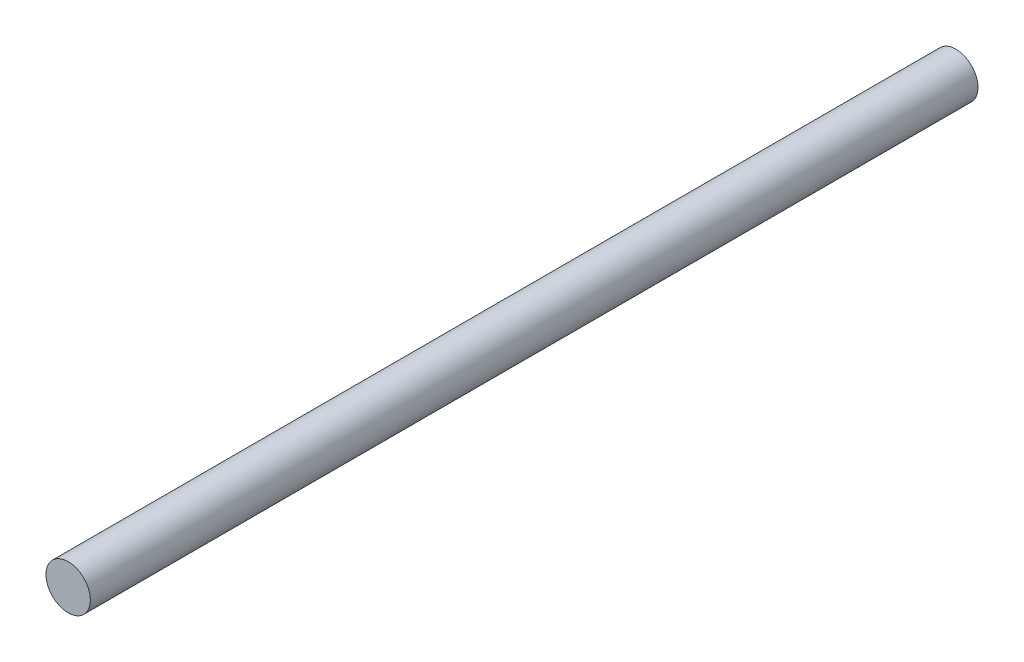
ISO-10303-21;
HEADER;
FILE_DESCRIPTION(('STEP AP214'),'2;1');
FILE_NAME('part.step','',(''),(''),'','','');
FILE_SCHEMA(('AUTOMOTIVE_DESIGN { 1 0 10303 214 1 1 1 1 }'));
ENDSEC;
DATA;
#1=APPLICATION_CONTEXT('core data for automotive mechanical design processes');
#2=APPLICATION_PROTOCOL_DEFINITION('international standard','automotive_design',2000,#1);
#3=PRODUCT_CONTEXT('',#1,'mechanical');
#4=PRODUCT('Part','Part','',(#3));
#5=PRODUCT_RELATED_PRODUCT_CATEGORY('part','',(#4));
#6=PRODUCT_DEFINITION_FORMATION('','',#4);
#7=PRODUCT_DEFINITION_CONTEXT('part definition',#1,'design');
#8=PRODUCT_DEFINITION('design','',#6,#7);
#9=PRODUCT_DEFINITION_SHAPE('','',#8);
#10=(LENGTH_UNIT() NAMED_UNIT(*) SI_UNIT(.MILLI.,.METRE.));
#11=(NAMED_UNIT(*) PLANE_ANGLE_UNIT() SI_UNIT($,.RADIAN.));
#12=(NAMED_UNIT(*) SI_UNIT($,.STERADIAN.) SOLID_ANGLE_UNIT());
#13=UNCERTAINTY_MEASURE_WITH_UNIT(LENGTH_MEASURE(1.E-05),#10,'distance_accuracy_value','');
#14=(GEOMETRIC_REPRESENTATION_CONTEXT(3) GLOBAL_UNCERTAINTY_ASSIGNED_CONTEXT((#13)) GLOBAL_UNIT_ASSIGNED_CONTEXT((#10,
#11,#12)) REPRESENTATION_CONTEXT('',''));
#15=CARTESIAN_POINT('',(0.,0.,0.));
#16=DIRECTION('',(0.,0.,1.));
#17=DIRECTION('',(1.,0.,0.));
#18=AXIS2_PLACEMENT_3D('',#15,#16,#17);
#19=CARTESIAN_POINT('',(0.,0.,300.));
#20=DIRECTION('',(0.,0.,-1.));
#21=DIRECTION('',(-1.,0.,0.));
#22=AXIS2_PLACEMENT_3D('',#19,#20,#21);
#23=CYLINDRICAL_SURFACE('',#22,7.5);
#24=CARTESIAN_POINT('',(0.,0.,300.));
#25=DIRECTION('',(0.,0.,1.));
#26=DIRECTION('',(1.,0.,0.));
#27=AXIS2_PLACEMENT_3D('',#24,#25,#26);
#28=CIRCLE('',#27,7.5);
#29=CARTESIAN_POINT('',(7.5,0.,300.));
#30=VERTEX_POINT('',#29);
#31=EDGE_CURVE('E10',#30,#30,#28,.T.);
#32=ORIENTED_EDGE('',*,*,#31,.F.);
#33=EDGE_LOOP('',(#32));
#34=FACE_BOUND('',#33,.T.);
#35=CARTESIAN_POINT('',(0.,0.,0.));
#36=DIRECTION('',(0.,0.,1.));
#37=DIRECTION('',(1.,0.,0.));
#38=AXIS2_PLACEMENT_3D('',#35,#36,#37);
#39=CIRCLE('',#38,7.5);
#40=CARTESIAN_POINT('',(7.5,0.,0.));
#41=VERTEX_POINT('',#40);
#42=EDGE_CURVE('E44',#41,#41,#39,.T.);
#43=ORIENTED_EDGE('',*,*,#42,.T.);
#44=EDGE_LOOP('',(#43));
#45=FACE_BOUND('',#44,.T.);
#46=ADVANCED_FACE('F41',(#34,#45),#23,.T.);
#47=CARTESIAN_POINT('',(0.,0.,300.));
#48=DIRECTION('',(0.,0.,1.));
#49=DIRECTION('',(1.,0.,0.));
#50=AXIS2_PLACEMENT_3D('',#47,#48,#49);
#51=PLANE('',#50);
#52=ORIENTED_EDGE('',*,*,#31,.T.);
#53=EDGE_LOOP('',(#52));
#54=FACE_BOUND('',#53,.T.);
#55=ADVANCED_FACE('F58',(#54),#51,.T.);
#56=CARTESIAN_POINT('',(0.,0.,0.));
#57=DIRECTION('',(0.,0.,1.));
#58=DIRECTION('',(1.,0.,0.));
#59=AXIS2_PLACEMENT_3D('',#56,#57,#58);
#60=PLANE('',#59);
#61=ORIENTED_EDGE('',*,*,#42,.F.);
#62=EDGE_LOOP('',(#61));
#63=FACE_BOUND('',#62,.T.);
#64=ADVANCED_FACE('F56',(#63),#60,.F.);
#65=CLOSED_SHELL('',(#46,#55,#64));
#66=MANIFOLD_SOLID_BREP('B2',#65);
#67=ADVANCED_BREP_SHAPE_REPRESENTATION('',(#18,#66),#14);
#68=SHAPE_DEFINITION_REPRESENTATION(#9,#67);
ENDSEC;
END-ISO-10303-21;
